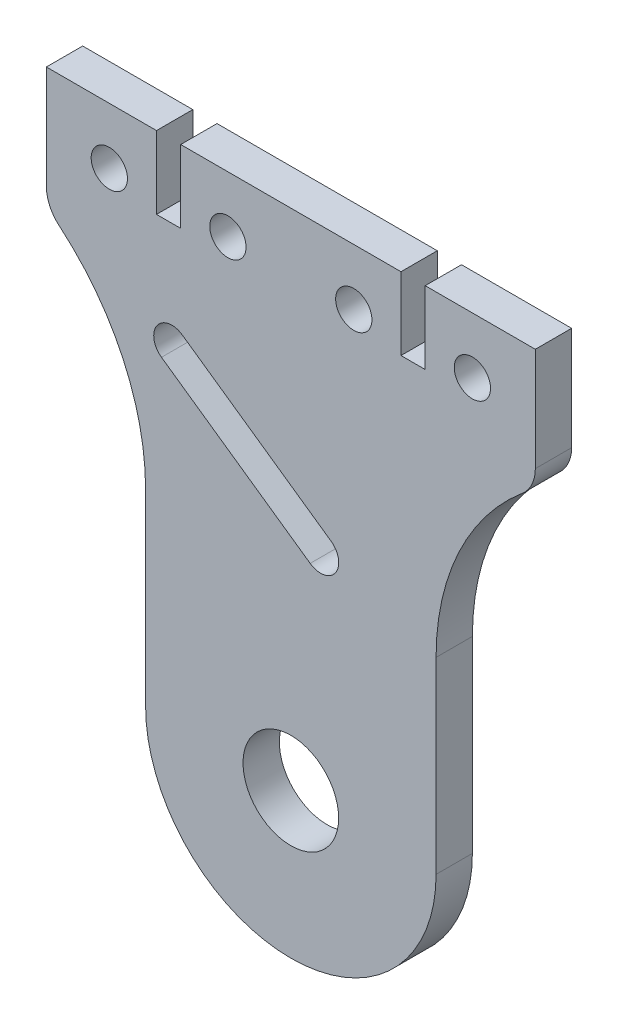
ISO-10303-21;
HEADER;
FILE_DESCRIPTION(('STEP AP214'),'2;1');
FILE_NAME('part.step','',(''),(''),'','','');
FILE_SCHEMA(('AUTOMOTIVE_DESIGN { 1 0 10303 214 1 1 1 1 }'));
ENDSEC;
DATA;
#1=APPLICATION_CONTEXT('core data for automotive mechanical design processes');
#2=APPLICATION_PROTOCOL_DEFINITION('international standard','automotive_design',2000,#1);
#3=PRODUCT_CONTEXT('',#1,'mechanical');
#4=PRODUCT('Part','Part','',(#3));
#5=PRODUCT_RELATED_PRODUCT_CATEGORY('part','',(#4));
#6=PRODUCT_DEFINITION_FORMATION('','',#4);
#7=PRODUCT_DEFINITION_CONTEXT('part definition',#1,'design');
#8=PRODUCT_DEFINITION('design','',#6,#7);
#9=PRODUCT_DEFINITION_SHAPE('','',#8);
#10=(LENGTH_UNIT() NAMED_UNIT(*) SI_UNIT(.MILLI.,.METRE.));
#11=(NAMED_UNIT(*) PLANE_ANGLE_UNIT() SI_UNIT($,.RADIAN.));
#12=(NAMED_UNIT(*) SI_UNIT($,.STERADIAN.) SOLID_ANGLE_UNIT());
#13=UNCERTAINTY_MEASURE_WITH_UNIT(LENGTH_MEASURE(1.E-05),#10,'distance_accuracy_value','');
#14=(GEOMETRIC_REPRESENTATION_CONTEXT(3) GLOBAL_UNCERTAINTY_ASSIGNED_CONTEXT((#13)) GLOBAL_UNIT_ASSIGNED_CONTEXT((#10,
#11,#12)) REPRESENTATION_CONTEXT('',''));
#15=CARTESIAN_POINT('',(0.,0.,0.));
#16=DIRECTION('',(0.,0.,1.));
#17=DIRECTION('',(1.,0.,0.));
#18=AXIS2_PLACEMENT_3D('',#15,#16,#17);
#19=CARTESIAN_POINT('',(0.,0.,3.));
#20=DIRECTION('',(0.,0.,1.));
#21=DIRECTION('',(1.,0.,0.));
#22=AXIS2_PLACEMENT_3D('',#19,#20,#21);
#23=PLANE('',#22);
#24=CARTESIAN_POINT('',(-9.82982453146787,26.8829172362126,3.));
#25=DIRECTION('',(0.,0.,1.));
#26=DIRECTION('',(1.,0.,0.));
#27=AXIS2_PLACEMENT_3D('',#24,#25,#26);
#28=CIRCLE('',#27,1.5);
#29=CARTESIAN_POINT('',(-8.9694598769413,28.1116453026461,3.));
#30=VERTEX_POINT('',#29);
#31=CARTESIAN_POINT('',(-10.6901891859944,25.6541891697791,3.));
#32=VERTEX_POINT('',#31);
#33=EDGE_CURVE('E48',#30,#32,#28,.T.);
#34=ORIENTED_EDGE('',*,*,#33,.F.);
#35=DIRECTION('',(-0.819152044288989,0.57357643635105,0.));
#36=VECTOR('',#35,1.);
#37=CARTESIAN_POINT('',(-8.9694598769413,28.1116453026461,3.));
#38=LINE('',#37,#36);
#39=CARTESIAN_POINT('',(3.31782078739354,19.5079987573803,3.));
#40=VERTEX_POINT('',#39);
#41=EDGE_CURVE('E189',#40,#30,#38,.T.);
#42=ORIENTED_EDGE('',*,*,#41,.F.);
#43=CARTESIAN_POINT('',(2.45745613286697,18.2792706909469,3.));
#44=DIRECTION('',(0.,0.,1.));
#45=DIRECTION('',(1.,0.,0.));
#46=AXIS2_PLACEMENT_3D('',#43,#44,#45);
#47=CIRCLE('',#46,1.5);
#48=CARTESIAN_POINT('',(1.5970914783404,17.0505426245134,3.));
#49=VERTEX_POINT('',#48);
#50=EDGE_CURVE('E209',#49,#40,#47,.T.);
#51=ORIENTED_EDGE('',*,*,#50,.F.);
#52=DIRECTION('',(0.819152044288989,-0.57357643635105,0.));
#53=VECTOR('',#52,1.);
#54=CARTESIAN_POINT('',(-10.6901891859944,25.6541891697791,3.));
#55=LINE('',#54,#53);
#56=EDGE_CURVE('E203',#32,#49,#55,.T.);
#57=ORIENTED_EDGE('',*,*,#56,.F.);
#58=EDGE_LOOP('',(#34,#42,#51,#57));
#59=FACE_BOUND('',#58,.T.);
#60=CARTESIAN_POINT('',(5.2,37.0240523814777,3.));
#61=DIRECTION('',(0.,0.,1.));
#62=DIRECTION('',(1.,0.,0.));
#63=AXIS2_PLACEMENT_3D('',#60,#61,#62);
#64=CIRCLE('',#63,1.5);
#65=CARTESIAN_POINT('',(6.7,37.0240523814777,3.));
#66=VERTEX_POINT('',#65);
#67=EDGE_CURVE('E224',#66,#66,#64,.T.);
#68=ORIENTED_EDGE('',*,*,#67,.F.);
#69=EDGE_LOOP('',(#68));
#70=FACE_BOUND('',#69,.T.);
#71=CARTESIAN_POINT('',(-15.,37.0240523814777,3.));
#72=DIRECTION('',(0.,0.,1.));
#73=DIRECTION('',(1.,0.,0.));
#74=AXIS2_PLACEMENT_3D('',#71,#72,#73);
#75=CIRCLE('',#74,1.5);
#76=CARTESIAN_POINT('',(-13.5,37.0240523814777,3.));
#77=VERTEX_POINT('',#76);
#78=EDGE_CURVE('E236',#77,#77,#75,.T.);
#79=ORIENTED_EDGE('',*,*,#78,.F.);
#80=EDGE_LOOP('',(#79));
#81=FACE_BOUND('',#80,.T.);
#82=CARTESIAN_POINT('',(32.,15.5259874819302,3.));
#83=DIRECTION('',(0.,0.,1.));
#84=DIRECTION('',(1.,0.,0.));
#85=AXIS2_PLACEMENT_3D('',#82,#83,#84);
#86=CIRCLE('',#85,20.);
#87=CARTESIAN_POINT('',(12.,15.5259874819302,3.));
#88=VERTEX_POINT('',#87);
#89=CARTESIAN_POINT('',(19.1304347826087,30.8352752222306,3.));
#90=VERTEX_POINT('',#89);
#91=EDGE_CURVE('E357',#88,#90,#86,.F.);
#92=ORIENTED_EDGE('',*,*,#91,.T.);
#93=CARTESIAN_POINT('',(17.2,33.1316683832756,3.));
#94=DIRECTION('',(0.,0.,1.));
#95=DIRECTION('',(1.,0.,0.));
#96=AXIS2_PLACEMENT_3D('',#93,#94,#95);
#97=CIRCLE('',#96,3.);
#98=CARTESIAN_POINT('',(20.2,33.1316683832756,3.));
#99=VERTEX_POINT('',#98);
#100=EDGE_CURVE('E371',#90,#99,#97,.T.);
#101=ORIENTED_EDGE('',*,*,#100,.T.);
#102=DIRECTION('',(0.,1.,0.));
#103=VECTOR('',#102,1.);
#104=CARTESIAN_POINT('',(20.2,41.6740523814777,3.));
#105=LINE('',#104,#103);
#106=CARTESIAN_POINT('',(20.2,41.6740523814777,3.));
#107=VERTEX_POINT('',#106);
#108=EDGE_CURVE('E270',#99,#107,#105,.T.);
#109=ORIENTED_EDGE('',*,*,#108,.T.);
#110=DIRECTION('',(-1.,0.,0.));
#111=VECTOR('',#110,1.);
#112=CARTESIAN_POINT('',(11.1,41.6740523814777,3.));
#113=LINE('',#112,#111);
#114=CARTESIAN_POINT('',(11.1,41.6740523814777,3.));
#115=VERTEX_POINT('',#114);
#116=EDGE_CURVE('E272',#107,#115,#113,.T.);
#117=ORIENTED_EDGE('',*,*,#116,.T.);
#118=DIRECTION('',(0.,-1.,0.));
#119=VECTOR('',#118,1.);
#120=CARTESIAN_POINT('',(11.1,41.6740523814777,3.));
#121=LINE('',#120,#119);
#122=CARTESIAN_POINT('',(11.1,35.6740523814777,3.));
#123=VERTEX_POINT('',#122);
#124=EDGE_CURVE('E274',#115,#123,#121,.T.);
#125=ORIENTED_EDGE('',*,*,#124,.T.);
#126=DIRECTION('',(-1.,0.,0.));
#127=VECTOR('',#126,1.);
#128=CARTESIAN_POINT('',(9.1,35.6740523814777,3.));
#129=LINE('',#128,#127);
#130=CARTESIAN_POINT('',(9.1,35.6740523814777,3.));
#131=VERTEX_POINT('',#130);
#132=EDGE_CURVE('E276',#123,#131,#129,.T.);
#133=ORIENTED_EDGE('',*,*,#132,.T.);
#134=DIRECTION('',(0.,1.,0.));
#135=VECTOR('',#134,1.);
#136=CARTESIAN_POINT('',(9.1,41.6740523814777,3.));
#137=LINE('',#136,#135);
#138=CARTESIAN_POINT('',(9.1,41.6740523814777,3.));
#139=VERTEX_POINT('',#138);
#140=EDGE_CURVE('E278',#131,#139,#137,.T.);
#141=ORIENTED_EDGE('',*,*,#140,.T.);
#142=DIRECTION('',(-1.,0.,0.));
#143=VECTOR('',#142,1.);
#144=CARTESIAN_POINT('',(-9.1,41.6740523814777,3.));
#145=LINE('',#144,#143);
#146=CARTESIAN_POINT('',(-9.1,41.6740523814777,3.));
#147=VERTEX_POINT('',#146);
#148=EDGE_CURVE('E248',#139,#147,#145,.T.);
#149=ORIENTED_EDGE('',*,*,#148,.T.);
#150=DIRECTION('',(0.,-1.,0.));
#151=VECTOR('',#150,1.);
#152=CARTESIAN_POINT('',(-9.1,41.6740523814777,3.));
#153=LINE('',#152,#151);
#154=CARTESIAN_POINT('',(-9.1,35.6740523814777,3.));
#155=VERTEX_POINT('',#154);
#156=EDGE_CURVE('E251',#147,#155,#153,.T.);
#157=ORIENTED_EDGE('',*,*,#156,.T.);
#158=DIRECTION('',(-1.,0.,0.));
#159=VECTOR('',#158,1.);
#160=CARTESIAN_POINT('',(-11.1,35.6740523814777,3.));
#161=LINE('',#160,#159);
#162=CARTESIAN_POINT('',(-11.1,35.6740523814777,3.));
#163=VERTEX_POINT('',#162);
#164=EDGE_CURVE('E254',#155,#163,#161,.T.);
#165=ORIENTED_EDGE('',*,*,#164,.T.);
#166=DIRECTION('',(0.,1.,0.));
#167=VECTOR('',#166,1.);
#168=CARTESIAN_POINT('',(-11.1,41.6740523814777,3.));
#169=LINE('',#168,#167);
#170=CARTESIAN_POINT('',(-11.1,41.6740523814777,3.));
#171=VERTEX_POINT('',#170);
#172=EDGE_CURVE('E256',#163,#171,#169,.T.);
#173=ORIENTED_EDGE('',*,*,#172,.T.);
#174=DIRECTION('',(-1.,0.,0.));
#175=VECTOR('',#174,1.);
#176=CARTESIAN_POINT('',(-20.2,41.6740523814777,3.));
#177=LINE('',#176,#175);
#178=CARTESIAN_POINT('',(-20.2,41.6740523814777,3.));
#179=VERTEX_POINT('',#178);
#180=EDGE_CURVE('E258',#171,#179,#177,.T.);
#181=ORIENTED_EDGE('',*,*,#180,.T.);
#182=DIRECTION('',(0.,-1.,0.));
#183=VECTOR('',#182,1.);
#184=CARTESIAN_POINT('',(-20.2,41.6740523814777,3.));
#185=LINE('',#184,#183);
#186=CARTESIAN_POINT('',(-20.2,33.1316683832756,3.));
#187=VERTEX_POINT('',#186);
#188=EDGE_CURVE('E260',#179,#187,#185,.T.);
#189=ORIENTED_EDGE('',*,*,#188,.T.);
#190=CARTESIAN_POINT('',(-17.2,33.1316683832756,3.));
#191=DIRECTION('',(0.,0.,1.));
#192=DIRECTION('',(1.,0.,0.));
#193=AXIS2_PLACEMENT_3D('',#190,#191,#192);
#194=CIRCLE('',#193,3.);
#195=CARTESIAN_POINT('',(-19.1304347826087,30.8352752222306,3.));
#196=VERTEX_POINT('',#195);
#197=EDGE_CURVE('E369',#187,#196,#194,.T.);
#198=ORIENTED_EDGE('',*,*,#197,.T.);
#199=CARTESIAN_POINT('',(-32.,15.5259874819302,3.));
#200=DIRECTION('',(0.,0.,1.));
#201=DIRECTION('',(1.,0.,0.));
#202=AXIS2_PLACEMENT_3D('',#199,#200,#201);
#203=CIRCLE('',#202,20.);
#204=CARTESIAN_POINT('',(-12.,15.5259874819302,3.));
#205=VERTEX_POINT('',#204);
#206=EDGE_CURVE('E353',#196,#205,#203,.F.);
#207=ORIENTED_EDGE('',*,*,#206,.T.);
#208=DIRECTION('',(0.,-1.,0.));
#209=VECTOR('',#208,1.);
#210=CARTESIAN_POINT('',(-12.,31.6740523814777,3.));
#211=LINE('',#210,#209);
#212=CARTESIAN_POINT('',(-12.,0.,3.));
#213=VERTEX_POINT('',#212);
#214=EDGE_CURVE('E263',#205,#213,#211,.T.);
#215=ORIENTED_EDGE('',*,*,#214,.T.);
#216=CARTESIAN_POINT('',(0.,0.,3.));
#217=DIRECTION('',(0.,0.,1.));
#218=DIRECTION('',(1.,0.,0.));
#219=AXIS2_PLACEMENT_3D('',#216,#217,#218);
#220=CIRCLE('',#219,12.);
#221=CARTESIAN_POINT('',(12.,0.,3.));
#222=VERTEX_POINT('',#221);
#223=EDGE_CURVE('E265',#213,#222,#220,.T.);
#224=ORIENTED_EDGE('',*,*,#223,.T.);
#225=DIRECTION('',(0.,1.,0.));
#226=VECTOR('',#225,1.);
#227=CARTESIAN_POINT('',(12.,31.6740523814777,3.));
#228=LINE('',#227,#226);
#229=EDGE_CURVE('E267',#222,#88,#228,.T.);
#230=ORIENTED_EDGE('',*,*,#229,.T.);
#231=EDGE_LOOP('',(#92,#101,#109,#117,#125,#133,#141,#149,#157,#165,#173,#181,#189,#198,#207,
#215,#224,#230));
#232=FACE_BOUND('',#231,.T.);
#233=CARTESIAN_POINT('',(0.,0.,3.));
#234=DIRECTION('',(0.,0.,1.));
#235=DIRECTION('',(1.,0.,0.));
#236=AXIS2_PLACEMENT_3D('',#233,#234,#235);
#237=CIRCLE('',#236,3.95);
#238=CARTESIAN_POINT('',(3.95,0.,3.));
#239=VERTEX_POINT('',#238);
#240=EDGE_CURVE('E242',#239,#239,#237,.T.);
#241=ORIENTED_EDGE('',*,*,#240,.F.);
#242=EDGE_LOOP('',(#241));
#243=FACE_BOUND('',#242,.T.);
#244=CARTESIAN_POINT('',(-5.19999999999999,37.0240523814777,3.));
#245=DIRECTION('',(0.,0.,1.));
#246=DIRECTION('',(1.,0.,0.));
#247=AXIS2_PLACEMENT_3D('',#244,#245,#246);
#248=CIRCLE('',#247,1.5);
#249=CARTESIAN_POINT('',(-3.69999999999999,37.0240523814777,3.));
#250=VERTEX_POINT('',#249);
#251=EDGE_CURVE('E230',#250,#250,#248,.T.);
#252=ORIENTED_EDGE('',*,*,#251,.F.);
#253=EDGE_LOOP('',(#252));
#254=FACE_BOUND('',#253,.T.);
#255=CARTESIAN_POINT('',(15.,37.0240523814777,3.));
#256=DIRECTION('',(0.,0.,1.));
#257=DIRECTION('',(1.,0.,0.));
#258=AXIS2_PLACEMENT_3D('',#255,#256,#257);
#259=CIRCLE('',#258,1.5);
#260=CARTESIAN_POINT('',(16.5,37.0240523814777,3.));
#261=VERTEX_POINT('',#260);
#262=EDGE_CURVE('E218',#261,#261,#259,.T.);
#263=ORIENTED_EDGE('',*,*,#262,.F.);
#264=EDGE_LOOP('',(#263));
#265=FACE_BOUND('',#264,.T.);
#266=ADVANCED_FACE('F33',(#59,#70,#81,#232,#243,#254,#265),#23,.T.);
#267=CARTESIAN_POINT('',(0.,0.,0.));
#268=DIRECTION('',(0.,0.,1.));
#269=DIRECTION('',(1.,0.,0.));
#270=AXIS2_PLACEMENT_3D('',#267,#268,#269);
#271=PLANE('',#270);
#272=DIRECTION('',(0.819152044288989,-0.57357643635105,0.));
#273=VECTOR('',#272,1.);
#274=CARTESIAN_POINT('',(-8.9694598769413,28.1116453026461,0.));
#275=LINE('',#274,#273);
#276=CARTESIAN_POINT('',(-8.9694598769413,28.1116453026461,0.));
#277=VERTEX_POINT('',#276);
#278=CARTESIAN_POINT('',(3.31782078739354,19.5079987573803,0.));
#279=VERTEX_POINT('',#278);
#280=EDGE_CURVE('E201',#277,#279,#275,.T.);
#281=ORIENTED_EDGE('',*,*,#280,.F.);
#282=CARTESIAN_POINT('',(-9.82982453146787,26.8829172362126,0.));
#283=DIRECTION('',(0.,0.,1.));
#284=DIRECTION('',(1.,0.,0.));
#285=AXIS2_PLACEMENT_3D('',#282,#283,#284);
#286=CIRCLE('',#285,1.5);
#287=CARTESIAN_POINT('',(-10.6901891859944,25.6541891697791,0.));
#288=VERTEX_POINT('',#287);
#289=EDGE_CURVE('E183',#288,#277,#286,.F.);
#290=ORIENTED_EDGE('',*,*,#289,.F.);
#291=DIRECTION('',(-0.819152044288989,0.57357643635105,0.));
#292=VECTOR('',#291,1.);
#293=CARTESIAN_POINT('',(-10.6901891859944,25.6541891697791,0.));
#294=LINE('',#293,#292);
#295=CARTESIAN_POINT('',(1.59709147834039,17.0505426245134,0.));
#296=VERTEX_POINT('',#295);
#297=EDGE_CURVE('E192',#296,#288,#294,.T.);
#298=ORIENTED_EDGE('',*,*,#297,.F.);
#299=CARTESIAN_POINT('',(2.45745613286697,18.2792706909469,0.));
#300=DIRECTION('',(0.,0.,1.));
#301=DIRECTION('',(1.,0.,0.));
#302=AXIS2_PLACEMENT_3D('',#299,#300,#301);
#303=CIRCLE('',#302,1.5);
#304=EDGE_CURVE('E56',#279,#296,#303,.F.);
#305=ORIENTED_EDGE('',*,*,#304,.F.);
#306=EDGE_LOOP('',(#281,#290,#298,#305));
#307=FACE_BOUND('',#306,.T.);
#308=CARTESIAN_POINT('',(5.2,37.0240523814777,0.));
#309=DIRECTION('',(0.,0.,1.));
#310=DIRECTION('',(1.,0.,0.));
#311=AXIS2_PLACEMENT_3D('',#308,#309,#310);
#312=CIRCLE('',#311,1.5);
#313=CARTESIAN_POINT('',(6.7,37.0240523814777,0.));
#314=VERTEX_POINT('',#313);
#315=EDGE_CURVE('E221',#314,#314,#312,.T.);
#316=ORIENTED_EDGE('',*,*,#315,.T.);
#317=EDGE_LOOP('',(#316));
#318=FACE_BOUND('',#317,.T.);
#319=CARTESIAN_POINT('',(-15.,37.0240523814777,0.));
#320=DIRECTION('',(0.,0.,1.));
#321=DIRECTION('',(1.,0.,0.));
#322=AXIS2_PLACEMENT_3D('',#319,#320,#321);
#323=CIRCLE('',#322,1.5);
#324=CARTESIAN_POINT('',(-13.5,37.0240523814777,0.));
#325=VERTEX_POINT('',#324);
#326=EDGE_CURVE('E233',#325,#325,#323,.T.);
#327=ORIENTED_EDGE('',*,*,#326,.T.);
#328=EDGE_LOOP('',(#327));
#329=FACE_BOUND('',#328,.T.);
#330=DIRECTION('',(0.,1.,0.));
#331=VECTOR('',#330,1.);
#332=CARTESIAN_POINT('',(20.2,41.6740523814777,0.));
#333=LINE('',#332,#331);
#334=CARTESIAN_POINT('',(20.2,33.1316683832756,0.));
#335=VERTEX_POINT('',#334);
#336=CARTESIAN_POINT('',(20.2,41.6740523814777,0.));
#337=VERTEX_POINT('',#336);
#338=EDGE_CURVE('E299',#335,#337,#333,.T.);
#339=ORIENTED_EDGE('',*,*,#338,.F.);
#340=CARTESIAN_POINT('',(17.2,33.1316683832756,0.));
#341=DIRECTION('',(0.,0.,1.));
#342=DIRECTION('',(1.,0.,0.));
#343=AXIS2_PLACEMENT_3D('',#340,#341,#342);
#344=CIRCLE('',#343,3.);
#345=CARTESIAN_POINT('',(19.1304347826087,30.8352752222306,0.));
#346=VERTEX_POINT('',#345);
#347=EDGE_CURVE('E365',#335,#346,#344,.F.);
#348=ORIENTED_EDGE('',*,*,#347,.T.);
#349=CARTESIAN_POINT('',(32.,15.5259874819302,0.));
#350=DIRECTION('',(0.,0.,1.));
#351=DIRECTION('',(1.,0.,0.));
#352=AXIS2_PLACEMENT_3D('',#349,#350,#351);
#353=CIRCLE('',#352,20.);
#354=CARTESIAN_POINT('',(12.,15.5259874819302,0.));
#355=VERTEX_POINT('',#354);
#356=EDGE_CURVE('E355',#346,#355,#353,.T.);
#357=ORIENTED_EDGE('',*,*,#356,.T.);
#358=DIRECTION('',(0.,1.,0.));
#359=VECTOR('',#358,1.);
#360=CARTESIAN_POINT('',(12.,31.6740523814777,0.));
#361=LINE('',#360,#359);
#362=CARTESIAN_POINT('',(12.,0.,0.));
#363=VERTEX_POINT('',#362);
#364=EDGE_CURVE('E296',#363,#355,#361,.T.);
#365=ORIENTED_EDGE('',*,*,#364,.F.);
#366=CARTESIAN_POINT('',(0.,0.,0.));
#367=DIRECTION('',(0.,0.,1.));
#368=DIRECTION('',(1.,0.,0.));
#369=AXIS2_PLACEMENT_3D('',#366,#367,#368);
#370=CIRCLE('',#369,12.);
#371=CARTESIAN_POINT('',(-12.,0.,0.));
#372=VERTEX_POINT('',#371);
#373=EDGE_CURVE('E294',#372,#363,#370,.T.);
#374=ORIENTED_EDGE('',*,*,#373,.F.);
#375=DIRECTION('',(0.,-1.,0.));
#376=VECTOR('',#375,1.);
#377=CARTESIAN_POINT('',(-12.,31.6740523814777,0.));
#378=LINE('',#377,#376);
#379=CARTESIAN_POINT('',(-12.,15.5259874819302,0.));
#380=VERTEX_POINT('',#379);
#381=EDGE_CURVE('E292',#380,#372,#378,.T.);
#382=ORIENTED_EDGE('',*,*,#381,.F.);
#383=CARTESIAN_POINT('',(-32.,15.5259874819302,0.));
#384=DIRECTION('',(0.,0.,1.));
#385=DIRECTION('',(1.,0.,0.));
#386=AXIS2_PLACEMENT_3D('',#383,#384,#385);
#387=CIRCLE('',#386,20.);
#388=CARTESIAN_POINT('',(-19.1304347826087,30.8352752222306,0.));
#389=VERTEX_POINT('',#388);
#390=EDGE_CURVE('E350',#380,#389,#387,.T.);
#391=ORIENTED_EDGE('',*,*,#390,.T.);
#392=CARTESIAN_POINT('',(-17.2,33.1316683832756,0.));
#393=DIRECTION('',(0.,0.,1.));
#394=DIRECTION('',(1.,0.,0.));
#395=AXIS2_PLACEMENT_3D('',#392,#393,#394);
#396=CIRCLE('',#395,3.);
#397=CARTESIAN_POINT('',(-20.2,33.1316683832756,0.));
#398=VERTEX_POINT('',#397);
#399=EDGE_CURVE('E363',#389,#398,#396,.F.);
#400=ORIENTED_EDGE('',*,*,#399,.T.);
#401=DIRECTION('',(0.,-1.,0.));
#402=VECTOR('',#401,1.);
#403=CARTESIAN_POINT('',(-20.2,41.6740523814777,0.));
#404=LINE('',#403,#402);
#405=CARTESIAN_POINT('',(-20.2,41.6740523814777,0.));
#406=VERTEX_POINT('',#405);
#407=EDGE_CURVE('E289',#406,#398,#404,.T.);
#408=ORIENTED_EDGE('',*,*,#407,.F.);
#409=DIRECTION('',(-1.,0.,0.));
#410=VECTOR('',#409,1.);
#411=CARTESIAN_POINT('',(-20.2,41.6740523814777,0.));
#412=LINE('',#411,#410);
#413=CARTESIAN_POINT('',(-11.1,41.6740523814777,0.));
#414=VERTEX_POINT('',#413);
#415=EDGE_CURVE('E287',#414,#406,#412,.T.);
#416=ORIENTED_EDGE('',*,*,#415,.F.);
#417=DIRECTION('',(0.,1.,0.));
#418=VECTOR('',#417,1.);
#419=CARTESIAN_POINT('',(-11.1,41.6740523814777,0.));
#420=LINE('',#419,#418);
#421=CARTESIAN_POINT('',(-11.1,35.6740523814777,0.));
#422=VERTEX_POINT('',#421);
#423=EDGE_CURVE('E285',#422,#414,#420,.T.);
#424=ORIENTED_EDGE('',*,*,#423,.F.);
#425=DIRECTION('',(-1.,0.,0.));
#426=VECTOR('',#425,1.);
#427=CARTESIAN_POINT('',(-11.1,35.6740523814777,0.));
#428=LINE('',#427,#426);
#429=CARTESIAN_POINT('',(-9.1,35.6740523814777,0.));
#430=VERTEX_POINT('',#429);
#431=EDGE_CURVE('E283',#430,#422,#428,.T.);
#432=ORIENTED_EDGE('',*,*,#431,.F.);
#433=DIRECTION('',(0.,-1.,0.));
#434=VECTOR('',#433,1.);
#435=CARTESIAN_POINT('',(-9.1,41.6740523814777,0.));
#436=LINE('',#435,#434);
#437=CARTESIAN_POINT('',(-9.1,41.6740523814777,0.));
#438=VERTEX_POINT('',#437);
#439=EDGE_CURVE('E245',#438,#430,#436,.T.);
#440=ORIENTED_EDGE('',*,*,#439,.F.);
#441=DIRECTION('',(-1.,0.,0.));
#442=VECTOR('',#441,1.);
#443=CARTESIAN_POINT('',(0.,41.6740523814777,0.));
#444=LINE('',#443,#442);
#445=CARTESIAN_POINT('',(9.1,41.6740523814777,0.));
#446=VERTEX_POINT('',#445);
#447=EDGE_CURVE('E252',#446,#438,#444,.T.);
#448=ORIENTED_EDGE('',*,*,#447,.F.);
#449=DIRECTION('',(0.,1.,0.));
#450=VECTOR('',#449,1.);
#451=CARTESIAN_POINT('',(9.1,41.6740523814777,0.));
#452=LINE('',#451,#450);
#453=CARTESIAN_POINT('',(9.1,35.6740523814777,0.));
#454=VERTEX_POINT('',#453);
#455=EDGE_CURVE('E307',#454,#446,#452,.T.);
#456=ORIENTED_EDGE('',*,*,#455,.F.);
#457=DIRECTION('',(-1.,0.,0.));
#458=VECTOR('',#457,1.);
#459=CARTESIAN_POINT('',(9.1,35.6740523814777,0.));
#460=LINE('',#459,#458);
#461=CARTESIAN_POINT('',(11.1,35.6740523814777,0.));
#462=VERTEX_POINT('',#461);
#463=EDGE_CURVE('E305',#462,#454,#460,.T.);
#464=ORIENTED_EDGE('',*,*,#463,.F.);
#465=DIRECTION('',(0.,-1.,0.));
#466=VECTOR('',#465,1.);
#467=CARTESIAN_POINT('',(11.1,41.6740523814777,0.));
#468=LINE('',#467,#466);
#469=CARTESIAN_POINT('',(11.1,41.6740523814777,0.));
#470=VERTEX_POINT('',#469);
#471=EDGE_CURVE('E303',#470,#462,#468,.T.);
#472=ORIENTED_EDGE('',*,*,#471,.F.);
#473=DIRECTION('',(-1.,0.,0.));
#474=VECTOR('',#473,1.);
#475=CARTESIAN_POINT('',(11.1,41.6740523814777,0.));
#476=LINE('',#475,#474);
#477=EDGE_CURVE('E301',#337,#470,#476,.T.);
#478=ORIENTED_EDGE('',*,*,#477,.F.);
#479=EDGE_LOOP('',(#339,#348,#357,#365,#374,#382,#391,#400,#408,#416,#424,#432,#440,#448,#456,
#464,#472,#478));
#480=FACE_BOUND('',#479,.T.);
#481=CARTESIAN_POINT('',(0.,0.,0.));
#482=DIRECTION('',(0.,0.,1.));
#483=DIRECTION('',(1.,0.,0.));
#484=AXIS2_PLACEMENT_3D('',#481,#482,#483);
#485=CIRCLE('',#484,3.95);
#486=CARTESIAN_POINT('',(3.95,0.,0.));
#487=VERTEX_POINT('',#486);
#488=EDGE_CURVE('E239',#487,#487,#485,.T.);
#489=ORIENTED_EDGE('',*,*,#488,.T.);
#490=EDGE_LOOP('',(#489));
#491=FACE_BOUND('',#490,.T.);
#492=CARTESIAN_POINT('',(-5.19999999999999,37.0240523814777,0.));
#493=DIRECTION('',(0.,0.,1.));
#494=DIRECTION('',(1.,0.,0.));
#495=AXIS2_PLACEMENT_3D('',#492,#493,#494);
#496=CIRCLE('',#495,1.5);
#497=CARTESIAN_POINT('',(-3.69999999999999,37.0240523814777,0.));
#498=VERTEX_POINT('',#497);
#499=EDGE_CURVE('E227',#498,#498,#496,.T.);
#500=ORIENTED_EDGE('',*,*,#499,.T.);
#501=EDGE_LOOP('',(#500));
#502=FACE_BOUND('',#501,.T.);
#503=CARTESIAN_POINT('',(15.,37.0240523814777,0.));
#504=DIRECTION('',(0.,0.,1.));
#505=DIRECTION('',(1.,0.,0.));
#506=AXIS2_PLACEMENT_3D('',#503,#504,#505);
#507=CIRCLE('',#506,1.5);
#508=CARTESIAN_POINT('',(16.5,37.0240523814777,0.));
#509=VERTEX_POINT('',#508);
#510=EDGE_CURVE('E195',#509,#509,#507,.T.);
#511=ORIENTED_EDGE('',*,*,#510,.T.);
#512=EDGE_LOOP('',(#511));
#513=FACE_BOUND('',#512,.T.);
#514=ADVANCED_FACE('F198',(#307,#318,#329,#480,#491,#502,#513),#271,.F.);
#515=CARTESIAN_POINT('',(-9.1,41.6740523814777,3.));
#516=DIRECTION('',(1.,0.,0.));
#517=DIRECTION('',(0.,0.,-1.));
#518=AXIS2_PLACEMENT_3D('',#515,#516,#517);
#519=PLANE('',#518);
#520=ORIENTED_EDGE('',*,*,#439,.T.);
#521=DIRECTION('',(0.,0.,-1.));
#522=VECTOR('',#521,1.);
#523=CARTESIAN_POINT('',(-9.1,35.6740523814777,3.));
#524=LINE('',#523,#522);
#525=EDGE_CURVE('E339',#155,#430,#524,.T.);
#526=ORIENTED_EDGE('',*,*,#525,.F.);
#527=ORIENTED_EDGE('',*,*,#156,.F.);
#528=DIRECTION('',(0.,0.,-1.));
#529=VECTOR('',#528,1.);
#530=CARTESIAN_POINT('',(-9.1,41.6740523814777,3.));
#531=LINE('',#530,#529);
#532=EDGE_CURVE('E342',#147,#438,#531,.T.);
#533=ORIENTED_EDGE('',*,*,#532,.T.);
#534=EDGE_LOOP('',(#520,#526,#527,#533));
#535=FACE_BOUND('',#534,.T.);
#536=ADVANCED_FACE('F424',(#535),#519,.F.);
#537=CARTESIAN_POINT('',(-11.1,35.6740523814777,3.));
#538=DIRECTION('',(0.,-1.,0.));
#539=DIRECTION('',(0.,0.,-1.));
#540=AXIS2_PLACEMENT_3D('',#537,#538,#539);
#541=PLANE('',#540);
#542=ORIENTED_EDGE('',*,*,#431,.T.);
#543=DIRECTION('',(0.,0.,-1.));
#544=VECTOR('',#543,1.);
#545=CARTESIAN_POINT('',(-11.1,35.6740523814777,3.));
#546=LINE('',#545,#544);
#547=EDGE_CURVE('E336',#163,#422,#546,.T.);
#548=ORIENTED_EDGE('',*,*,#547,.F.);
#549=ORIENTED_EDGE('',*,*,#164,.F.);
#550=ORIENTED_EDGE('',*,*,#525,.T.);
#551=EDGE_LOOP('',(#542,#548,#549,#550));
#552=FACE_BOUND('',#551,.T.);
#553=ADVANCED_FACE('F417',(#552),#541,.F.);
#554=CARTESIAN_POINT('',(-11.1,41.6740523814777,3.));
#555=DIRECTION('',(-1.,0.,0.));
#556=DIRECTION('',(0.,0.,1.));
#557=AXIS2_PLACEMENT_3D('',#554,#555,#556);
#558=PLANE('',#557);
#559=ORIENTED_EDGE('',*,*,#423,.T.);
#560=DIRECTION('',(0.,0.,-1.));
#561=VECTOR('',#560,1.);
#562=CARTESIAN_POINT('',(-11.1,41.6740523814777,3.));
#563=LINE('',#562,#561);
#564=EDGE_CURVE('E333',#171,#414,#563,.T.);
#565=ORIENTED_EDGE('',*,*,#564,.F.);
#566=ORIENTED_EDGE('',*,*,#172,.F.);
#567=ORIENTED_EDGE('',*,*,#547,.T.);
#568=EDGE_LOOP('',(#559,#565,#566,#567));
#569=FACE_BOUND('',#568,.T.);
#570=ADVANCED_FACE('F413',(#569),#558,.F.);
#571=CARTESIAN_POINT('',(-20.2,41.6740523814777,3.));
#572=DIRECTION('',(0.,-1.,0.));
#573=DIRECTION('',(0.,0.,-1.));
#574=AXIS2_PLACEMENT_3D('',#571,#572,#573);
#575=PLANE('',#574);
#576=ORIENTED_EDGE('',*,*,#415,.T.);
#577=DIRECTION('',(0.,0.,-1.));
#578=VECTOR('',#577,1.);
#579=CARTESIAN_POINT('',(-20.2,41.6740523814777,3.));
#580=LINE('',#579,#578);
#581=EDGE_CURVE('E330',#179,#406,#580,.T.);
#582=ORIENTED_EDGE('',*,*,#581,.F.);
#583=ORIENTED_EDGE('',*,*,#180,.F.);
#584=ORIENTED_EDGE('',*,*,#564,.T.);
#585=EDGE_LOOP('',(#576,#582,#583,#584));
#586=FACE_BOUND('',#585,.T.);
#587=ADVANCED_FACE('F408',(#586),#575,.F.);
#588=CARTESIAN_POINT('',(-20.2,41.6740523814777,3.));
#589=DIRECTION('',(1.,0.,0.));
#590=DIRECTION('',(0.,0.,-1.));
#591=AXIS2_PLACEMENT_3D('',#588,#589,#590);
#592=PLANE('',#591);
#593=ORIENTED_EDGE('',*,*,#407,.T.);
#594=DIRECTION('',(0.,0.,-1.));
#595=VECTOR('',#594,1.);
#596=CARTESIAN_POINT('',(-20.2,33.1316683832756,3.));
#597=LINE('',#596,#595);
#598=EDGE_CURVE('E11',#398,#187,#597,.F.);
#599=ORIENTED_EDGE('',*,*,#598,.T.);
#600=ORIENTED_EDGE('',*,*,#188,.F.);
#601=ORIENTED_EDGE('',*,*,#581,.T.);
#602=EDGE_LOOP('',(#593,#599,#600,#601));
#603=FACE_BOUND('',#602,.T.);
#604=ADVANCED_FACE('F402',(#603),#592,.F.);
#605=CARTESIAN_POINT('',(-12.,31.6740523814777,3.));
#606=DIRECTION('',(1.,0.,0.));
#607=DIRECTION('',(0.,1.,0.));
#608=AXIS2_PLACEMENT_3D('',#605,#606,#607);
#609=PLANE('',#608);
#610=ORIENTED_EDGE('',*,*,#214,.F.);
#611=DIRECTION('',(0.,0.,-1.));
#612=VECTOR('',#611,1.);
#613=CARTESIAN_POINT('',(-12.,15.5259874819302,3.));
#614=LINE('',#613,#612);
#615=EDGE_CURVE('E345',#205,#380,#614,.T.);
#616=ORIENTED_EDGE('',*,*,#615,.T.);
#617=ORIENTED_EDGE('',*,*,#381,.T.);
#618=DIRECTION('',(0.,0.,-1.));
#619=VECTOR('',#618,1.);
#620=CARTESIAN_POINT('',(-12.,0.,3.));
#621=LINE('',#620,#619);
#622=EDGE_CURVE('E327',#213,#372,#621,.T.);
#623=ORIENTED_EDGE('',*,*,#622,.F.);
#624=EDGE_LOOP('',(#610,#616,#617,#623));
#625=FACE_BOUND('',#624,.T.);
#626=ADVANCED_FACE('F390',(#625),#609,.F.);
#627=CARTESIAN_POINT('',(0.,0.,3.));
#628=DIRECTION('',(0.,0.,-1.));
#629=DIRECTION('',(-1.,0.,0.));
#630=AXIS2_PLACEMENT_3D('',#627,#628,#629);
#631=CYLINDRICAL_SURFACE('',#630,12.);
#632=ORIENTED_EDGE('',*,*,#373,.T.);
#633=DIRECTION('',(0.,0.,-1.));
#634=VECTOR('',#633,1.);
#635=CARTESIAN_POINT('',(12.,0.,3.));
#636=LINE('',#635,#634);
#637=EDGE_CURVE('E324',#222,#363,#636,.T.);
#638=ORIENTED_EDGE('',*,*,#637,.F.);
#639=ORIENTED_EDGE('',*,*,#223,.F.);
#640=ORIENTED_EDGE('',*,*,#622,.T.);
#641=EDGE_LOOP('',(#632,#638,#639,#640));
#642=FACE_BOUND('',#641,.T.);
#643=ADVANCED_FACE('F393',(#642),#631,.T.);
#644=CARTESIAN_POINT('',(12.,31.6740523814777,3.));
#645=DIRECTION('',(-1.,0.,0.));
#646=DIRECTION('',(0.,-1.,0.));
#647=AXIS2_PLACEMENT_3D('',#644,#645,#646);
#648=PLANE('',#647);
#649=ORIENTED_EDGE('',*,*,#364,.T.);
#650=DIRECTION('',(0.,0.,1.));
#651=VECTOR('',#650,1.);
#652=CARTESIAN_POINT('',(12.,15.5259874819302,3.));
#653=LINE('',#652,#651);
#654=EDGE_CURVE('E348',#355,#88,#653,.T.);
#655=ORIENTED_EDGE('',*,*,#654,.T.);
#656=ORIENTED_EDGE('',*,*,#229,.F.);
#657=ORIENTED_EDGE('',*,*,#637,.T.);
#658=EDGE_LOOP('',(#649,#655,#656,#657));
#659=FACE_BOUND('',#658,.T.);
#660=ADVANCED_FACE('F460',(#659),#648,.F.);
#661=CARTESIAN_POINT('',(20.2,41.6740523814777,3.));
#662=DIRECTION('',(-1.,0.,0.));
#663=DIRECTION('',(0.,0.,1.));
#664=AXIS2_PLACEMENT_3D('',#661,#662,#663);
#665=PLANE('',#664);
#666=ORIENTED_EDGE('',*,*,#108,.F.);
#667=DIRECTION('',(0.,0.,1.));
#668=VECTOR('',#667,1.);
#669=CARTESIAN_POINT('',(20.2,33.1316683832756,3.));
#670=LINE('',#669,#668);
#671=EDGE_CURVE('E360',#99,#335,#670,.F.);
#672=ORIENTED_EDGE('',*,*,#671,.T.);
#673=ORIENTED_EDGE('',*,*,#338,.T.);
#674=DIRECTION('',(0.,0.,-1.));
#675=VECTOR('',#674,1.);
#676=CARTESIAN_POINT('',(20.2,41.6740523814777,3.));
#677=LINE('',#676,#675);
#678=EDGE_CURVE('E321',#107,#337,#677,.T.);
#679=ORIENTED_EDGE('',*,*,#678,.F.);
#680=EDGE_LOOP('',(#666,#672,#673,#679));
#681=FACE_BOUND('',#680,.T.);
#682=ADVANCED_FACE('F450',(#681),#665,.F.);
#683=CARTESIAN_POINT('',(11.1,41.6740523814777,3.));
#684=DIRECTION('',(0.,-1.,0.));
#685=DIRECTION('',(0.,0.,-1.));
#686=AXIS2_PLACEMENT_3D('',#683,#684,#685);
#687=PLANE('',#686);
#688=ORIENTED_EDGE('',*,*,#477,.T.);
#689=DIRECTION('',(0.,0.,-1.));
#690=VECTOR('',#689,1.);
#691=CARTESIAN_POINT('',(11.1,41.6740523814777,3.));
#692=LINE('',#691,#690);
#693=EDGE_CURVE('E318',#115,#470,#692,.T.);
#694=ORIENTED_EDGE('',*,*,#693,.F.);
#695=ORIENTED_EDGE('',*,*,#116,.F.);
#696=ORIENTED_EDGE('',*,*,#678,.T.);
#697=EDGE_LOOP('',(#688,#694,#695,#696));
#698=FACE_BOUND('',#697,.T.);
#699=ADVANCED_FACE('F445',(#698),#687,.F.);
#700=CARTESIAN_POINT('',(11.1,41.6740523814777,3.));
#701=DIRECTION('',(1.,0.,0.));
#702=DIRECTION('',(0.,0.,-1.));
#703=AXIS2_PLACEMENT_3D('',#700,#701,#702);
#704=PLANE('',#703);
#705=ORIENTED_EDGE('',*,*,#471,.T.);
#706=DIRECTION('',(0.,0.,-1.));
#707=VECTOR('',#706,1.);
#708=CARTESIAN_POINT('',(11.1,35.6740523814777,3.));
#709=LINE('',#708,#707);
#710=EDGE_CURVE('E315',#123,#462,#709,.T.);
#711=ORIENTED_EDGE('',*,*,#710,.F.);
#712=ORIENTED_EDGE('',*,*,#124,.F.);
#713=ORIENTED_EDGE('',*,*,#693,.T.);
#714=EDGE_LOOP('',(#705,#711,#712,#713));
#715=FACE_BOUND('',#714,.T.);
#716=ADVANCED_FACE('F441',(#715),#704,.F.);
#717=CARTESIAN_POINT('',(9.1,35.6740523814777,3.));
#718=DIRECTION('',(0.,-1.,0.));
#719=DIRECTION('',(0.,0.,-1.));
#720=AXIS2_PLACEMENT_3D('',#717,#718,#719);
#721=PLANE('',#720);
#722=ORIENTED_EDGE('',*,*,#463,.T.);
#723=DIRECTION('',(0.,0.,-1.));
#724=VECTOR('',#723,1.);
#725=CARTESIAN_POINT('',(9.1,35.6740523814777,3.));
#726=LINE('',#725,#724);
#727=EDGE_CURVE('E312',#131,#454,#726,.T.);
#728=ORIENTED_EDGE('',*,*,#727,.F.);
#729=ORIENTED_EDGE('',*,*,#132,.F.);
#730=ORIENTED_EDGE('',*,*,#710,.T.);
#731=EDGE_LOOP('',(#722,#728,#729,#730));
#732=FACE_BOUND('',#731,.T.);
#733=ADVANCED_FACE('F436',(#732),#721,.F.);
#734=CARTESIAN_POINT('',(9.1,41.6740523814777,3.));
#735=DIRECTION('',(-1.,0.,0.));
#736=DIRECTION('',(0.,0.,1.));
#737=AXIS2_PLACEMENT_3D('',#734,#735,#736);
#738=PLANE('',#737);
#739=ORIENTED_EDGE('',*,*,#455,.T.);
#740=DIRECTION('',(0.,0.,-1.));
#741=VECTOR('',#740,1.);
#742=CARTESIAN_POINT('',(9.1,41.6740523814777,3.));
#743=LINE('',#742,#741);
#744=EDGE_CURVE('E281',#139,#446,#743,.T.);
#745=ORIENTED_EDGE('',*,*,#744,.F.);
#746=ORIENTED_EDGE('',*,*,#140,.F.);
#747=ORIENTED_EDGE('',*,*,#727,.T.);
#748=EDGE_LOOP('',(#739,#745,#746,#747));
#749=FACE_BOUND('',#748,.T.);
#750=ADVANCED_FACE('F430',(#749),#738,.F.);
#751=CARTESIAN_POINT('',(0.,41.6740523814777,3.));
#752=DIRECTION('',(0.,-1.,0.));
#753=DIRECTION('',(0.,0.,-1.));
#754=AXIS2_PLACEMENT_3D('',#751,#752,#753);
#755=PLANE('',#754);
#756=ORIENTED_EDGE('',*,*,#447,.T.);
#757=ORIENTED_EDGE('',*,*,#532,.F.);
#758=ORIENTED_EDGE('',*,*,#148,.F.);
#759=ORIENTED_EDGE('',*,*,#744,.T.);
#760=EDGE_LOOP('',(#756,#757,#758,#759));
#761=FACE_BOUND('',#760,.T.);
#762=ADVANCED_FACE('F426',(#761),#755,.F.);
#763=CARTESIAN_POINT('',(0.,0.,3.));
#764=DIRECTION('',(0.,0.,-1.));
#765=DIRECTION('',(-1.,0.,0.));
#766=AXIS2_PLACEMENT_3D('',#763,#764,#765);
#767=CYLINDRICAL_SURFACE('',#766,3.95);
#768=ORIENTED_EDGE('',*,*,#240,.T.);
#769=EDGE_LOOP('',(#768));
#770=FACE_BOUND('',#769,.T.);
#771=ORIENTED_EDGE('',*,*,#488,.F.);
#772=EDGE_LOOP('',(#771));
#773=FACE_BOUND('',#772,.T.);
#774=ADVANCED_FACE('F478',(#770,#773),#767,.F.);
#775=CARTESIAN_POINT('',(-15.,37.0240523814777,3.));
#776=DIRECTION('',(0.,0.,-1.));
#777=DIRECTION('',(-1.,0.,0.));
#778=AXIS2_PLACEMENT_3D('',#775,#776,#777);
#779=CYLINDRICAL_SURFACE('',#778,1.5);
#780=ORIENTED_EDGE('',*,*,#78,.T.);
#781=EDGE_LOOP('',(#780));
#782=FACE_BOUND('',#781,.T.);
#783=ORIENTED_EDGE('',*,*,#326,.F.);
#784=EDGE_LOOP('',(#783));
#785=FACE_BOUND('',#784,.T.);
#786=ADVANCED_FACE('F517',(#782,#785),#779,.F.);
#787=CARTESIAN_POINT('',(-5.19999999999999,37.0240523814777,3.));
#788=DIRECTION('',(0.,0.,-1.));
#789=DIRECTION('',(-1.,0.,0.));
#790=AXIS2_PLACEMENT_3D('',#787,#788,#789);
#791=CYLINDRICAL_SURFACE('',#790,1.5);
#792=ORIENTED_EDGE('',*,*,#251,.T.);
#793=EDGE_LOOP('',(#792));
#794=FACE_BOUND('',#793,.T.);
#795=ORIENTED_EDGE('',*,*,#499,.F.);
#796=EDGE_LOOP('',(#795));
#797=FACE_BOUND('',#796,.T.);
#798=ADVANCED_FACE('F524',(#794,#797),#791,.F.);
#799=CARTESIAN_POINT('',(5.2,37.0240523814777,3.));
#800=DIRECTION('',(0.,0.,-1.));
#801=DIRECTION('',(-1.,0.,0.));
#802=AXIS2_PLACEMENT_3D('',#799,#800,#801);
#803=CYLINDRICAL_SURFACE('',#802,1.5);
#804=ORIENTED_EDGE('',*,*,#67,.T.);
#805=EDGE_LOOP('',(#804));
#806=FACE_BOUND('',#805,.T.);
#807=ORIENTED_EDGE('',*,*,#315,.F.);
#808=EDGE_LOOP('',(#807));
#809=FACE_BOUND('',#808,.T.);
#810=ADVANCED_FACE('F531',(#806,#809),#803,.F.);
#811=CARTESIAN_POINT('',(15.,37.0240523814777,3.));
#812=DIRECTION('',(0.,0.,-1.));
#813=DIRECTION('',(-1.,0.,0.));
#814=AXIS2_PLACEMENT_3D('',#811,#812,#813);
#815=CYLINDRICAL_SURFACE('',#814,1.5);
#816=ORIENTED_EDGE('',*,*,#262,.T.);
#817=EDGE_LOOP('',(#816));
#818=FACE_BOUND('',#817,.T.);
#819=ORIENTED_EDGE('',*,*,#510,.F.);
#820=EDGE_LOOP('',(#819));
#821=FACE_BOUND('',#820,.T.);
#822=ADVANCED_FACE('F539',(#818,#821),#815,.F.);
#823=CARTESIAN_POINT('',(-32.,15.5259874819302,3.));
#824=DIRECTION('',(0.,0.,-1.));
#825=DIRECTION('',(-1.,0.,0.));
#826=AXIS2_PLACEMENT_3D('',#823,#824,#825);
#827=CYLINDRICAL_SURFACE('',#826,20.);
#828=ORIENTED_EDGE('',*,*,#206,.F.);
#829=DIRECTION('',(0.,0.,-1.));
#830=VECTOR('',#829,1.);
#831=CARTESIAN_POINT('',(-19.1304347826087,30.8352752222306,3.));
#832=LINE('',#831,#830);
#833=EDGE_CURVE('E41',#196,#389,#832,.T.);
#834=ORIENTED_EDGE('',*,*,#833,.T.);
#835=ORIENTED_EDGE('',*,*,#390,.F.);
#836=ORIENTED_EDGE('',*,*,#615,.F.);
#837=EDGE_LOOP('',(#828,#834,#835,#836));
#838=FACE_BOUND('',#837,.T.);
#839=ADVANCED_FACE('F376',(#838),#827,.F.);
#840=CARTESIAN_POINT('',(32.,15.5259874819302,3.));
#841=DIRECTION('',(0.,0.,1.));
#842=DIRECTION('',(1.,0.,0.));
#843=AXIS2_PLACEMENT_3D('',#840,#841,#842);
#844=CYLINDRICAL_SURFACE('',#843,20.);
#845=ORIENTED_EDGE('',*,*,#356,.F.);
#846=DIRECTION('',(0.,0.,1.));
#847=VECTOR('',#846,1.);
#848=CARTESIAN_POINT('',(19.1304347826087,30.8352752222306,3.));
#849=LINE('',#848,#847);
#850=EDGE_CURVE('E367',#346,#90,#849,.T.);
#851=ORIENTED_EDGE('',*,*,#850,.T.);
#852=ORIENTED_EDGE('',*,*,#91,.F.);
#853=ORIENTED_EDGE('',*,*,#654,.F.);
#854=EDGE_LOOP('',(#845,#851,#852,#853));
#855=FACE_BOUND('',#854,.T.);
#856=ADVANCED_FACE('F457',(#855),#844,.F.);
#857=CARTESIAN_POINT('',(17.2,33.1316683832756,3.));
#858=DIRECTION('',(0.,0.,1.));
#859=DIRECTION('',(1.,0.,0.));
#860=AXIS2_PLACEMENT_3D('',#857,#858,#859);
#861=CYLINDRICAL_SURFACE('',#860,3.);
#862=ORIENTED_EDGE('',*,*,#100,.F.);
#863=ORIENTED_EDGE('',*,*,#850,.F.);
#864=ORIENTED_EDGE('',*,*,#347,.F.);
#865=ORIENTED_EDGE('',*,*,#671,.F.);
#866=EDGE_LOOP('',(#862,#863,#864,#865));
#867=FACE_BOUND('',#866,.T.);
#868=ADVANCED_FACE('F454',(#867),#861,.T.);
#869=CARTESIAN_POINT('',(-17.2,33.1316683832756,3.));
#870=DIRECTION('',(0.,0.,-1.));
#871=DIRECTION('',(-1.,0.,0.));
#872=AXIS2_PLACEMENT_3D('',#869,#870,#871);
#873=CYLINDRICAL_SURFACE('',#872,3.);
#874=ORIENTED_EDGE('',*,*,#197,.F.);
#875=ORIENTED_EDGE('',*,*,#598,.F.);
#876=ORIENTED_EDGE('',*,*,#399,.F.);
#877=ORIENTED_EDGE('',*,*,#833,.F.);
#878=EDGE_LOOP('',(#874,#875,#876,#877));
#879=FACE_BOUND('',#878,.T.);
#880=ADVANCED_FACE('F35',(#879),#873,.T.);
#881=CARTESIAN_POINT('',(-9.82982453146787,26.8829172362126,-0.00100000000000013));
#882=DIRECTION('',(0.,0.,1.));
#883=DIRECTION('',(1.,0.,0.));
#884=AXIS2_PLACEMENT_3D('',#881,#882,#883);
#885=CYLINDRICAL_SURFACE('',#884,1.5);
#886=ORIENTED_EDGE('',*,*,#289,.T.);
#887=DIRECTION('',(0.,0.,1.));
#888=VECTOR('',#887,1.);
#889=CARTESIAN_POINT('',(-8.9694598769413,28.1116453026461,-0.00100000000000013));
#890=LINE('',#889,#888);
#891=EDGE_CURVE('E196',#277,#30,#890,.T.);
#892=ORIENTED_EDGE('',*,*,#891,.T.);
#893=ORIENTED_EDGE('',*,*,#33,.T.);
#894=DIRECTION('',(0.,0.,1.));
#895=VECTOR('',#894,1.);
#896=CARTESIAN_POINT('',(-10.6901891859944,25.6541891697791,-0.00100000000000013));
#897=LINE('',#896,#895);
#898=EDGE_CURVE('E179',#288,#32,#897,.T.);
#899=ORIENTED_EDGE('',*,*,#898,.F.);
#900=EDGE_LOOP('',(#886,#892,#893,#899));
#901=FACE_BOUND('',#900,.T.);
#902=ADVANCED_FACE('F181',(#901),#885,.F.);
#903=CARTESIAN_POINT('',(-8.9694598769413,28.1116453026461,-0.00100000000000013));
#904=DIRECTION('',(0.57357643635105,0.819152044288989,0.));
#905=DIRECTION('',(-0.819152044288989,0.57357643635105,0.));
#906=AXIS2_PLACEMENT_3D('',#903,#904,#905);
#907=PLANE('',#906);
#908=ORIENTED_EDGE('',*,*,#280,.T.);
#909=DIRECTION('',(0.,0.,1.));
#910=VECTOR('',#909,1.);
#911=CARTESIAN_POINT('',(3.31782078739354,19.5079987573803,-0.00100000000000013));
#912=LINE('',#911,#910);
#913=EDGE_CURVE('E215',#279,#40,#912,.T.);
#914=ORIENTED_EDGE('',*,*,#913,.T.);
#915=ORIENTED_EDGE('',*,*,#41,.T.);
#916=ORIENTED_EDGE('',*,*,#891,.F.);
#917=EDGE_LOOP('',(#908,#914,#915,#916));
#918=FACE_BOUND('',#917,.T.);
#919=ADVANCED_FACE('F577',(#918),#907,.F.);
#920=CARTESIAN_POINT('',(2.45745613286697,18.2792706909469,-0.00100000000000013));
#921=DIRECTION('',(0.,0.,1.));
#922=DIRECTION('',(1.,0.,0.));
#923=AXIS2_PLACEMENT_3D('',#920,#921,#922);
#924=CYLINDRICAL_SURFACE('',#923,1.5);
#925=ORIENTED_EDGE('',*,*,#304,.T.);
#926=DIRECTION('',(0.,0.,1.));
#927=VECTOR('',#926,1.);
#928=CARTESIAN_POINT('',(1.5970914783404,17.0505426245134,-0.00100000000000013));
#929=LINE('',#928,#927);
#930=EDGE_CURVE('E188',#296,#49,#929,.T.);
#931=ORIENTED_EDGE('',*,*,#930,.T.);
#932=ORIENTED_EDGE('',*,*,#50,.T.);
#933=ORIENTED_EDGE('',*,*,#913,.F.);
#934=EDGE_LOOP('',(#925,#931,#932,#933));
#935=FACE_BOUND('',#934,.T.);
#936=ADVANCED_FACE('F585',(#935),#924,.F.);
#937=CARTESIAN_POINT('',(-10.6901891859944,25.6541891697791,-0.00100000000000013));
#938=DIRECTION('',(-0.57357643635105,-0.819152044288989,0.));
#939=DIRECTION('',(0.819152044288989,-0.57357643635105,0.));
#940=AXIS2_PLACEMENT_3D('',#937,#938,#939);
#941=PLANE('',#940);
#942=ORIENTED_EDGE('',*,*,#297,.T.);
#943=ORIENTED_EDGE('',*,*,#898,.T.);
#944=ORIENTED_EDGE('',*,*,#56,.T.);
#945=ORIENTED_EDGE('',*,*,#930,.F.);
#946=EDGE_LOOP('',(#942,#943,#944,#945));
#947=FACE_BOUND('',#946,.T.);
#948=ADVANCED_FACE('F193',(#947),#941,.F.);
#949=CLOSED_SHELL('',(#266,#514,#536,#553,#570,#587,#604,#626,#643,#660,#682,#699,#716,#733,
#750,#762,#774,#786,#798,#810,#822,#839,#856,#868,#880,#902,#919,#936,#948));
#950=MANIFOLD_SOLID_BREP('B2',#949);
#951=ADVANCED_BREP_SHAPE_REPRESENTATION('',(#18,#950),#14);
#952=SHAPE_DEFINITION_REPRESENTATION(#9,#951);
ENDSEC;
END-ISO-10303-21;
